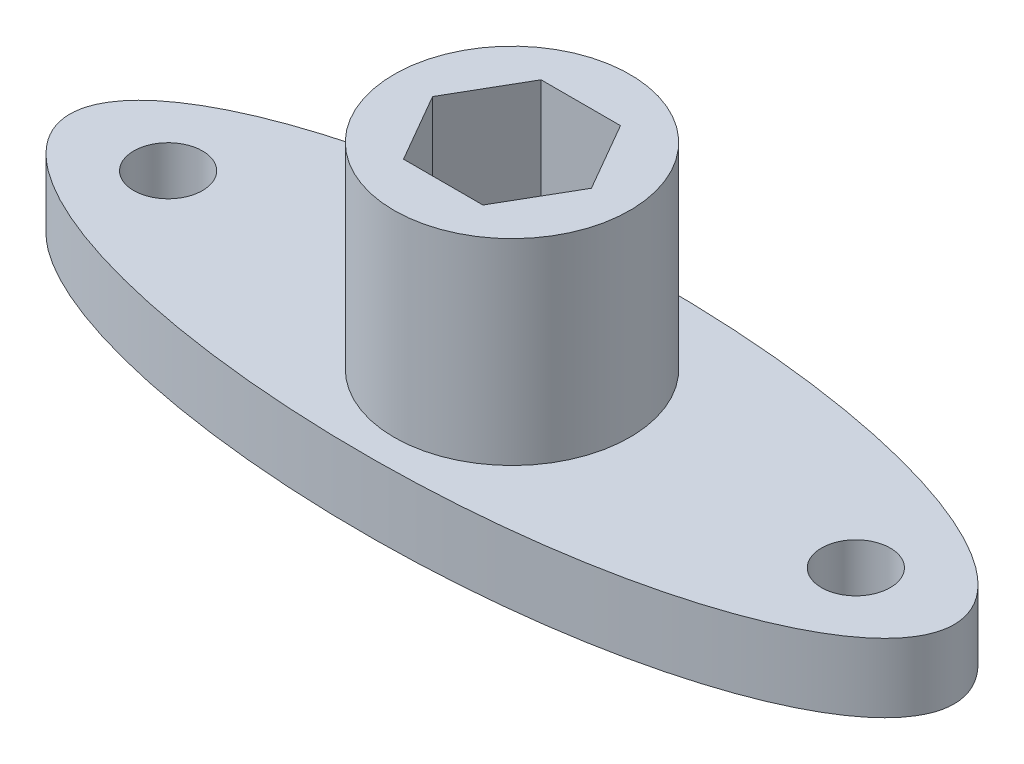
ISO-10303-21;
HEADER;
FILE_DESCRIPTION(('STEP AP214'),'2;1');
FILE_NAME('part.step','',(''),(''),'','','');
FILE_SCHEMA(('AUTOMOTIVE_DESIGN { 1 0 10303 214 1 1 1 1 }'));
ENDSEC;
DATA;
#1=APPLICATION_CONTEXT('core data for automotive mechanical design processes');
#2=APPLICATION_PROTOCOL_DEFINITION('international standard','automotive_design',2000,#1);
#3=PRODUCT_CONTEXT('',#1,'mechanical');
#4=PRODUCT('Part','Part','',(#3));
#5=PRODUCT_RELATED_PRODUCT_CATEGORY('part','',(#4));
#6=PRODUCT_DEFINITION_FORMATION('','',#4);
#7=PRODUCT_DEFINITION_CONTEXT('part definition',#1,'design');
#8=PRODUCT_DEFINITION('design','',#6,#7);
#9=PRODUCT_DEFINITION_SHAPE('','',#8);
#10=(LENGTH_UNIT() NAMED_UNIT(*) SI_UNIT(.MILLI.,.METRE.));
#11=(NAMED_UNIT(*) PLANE_ANGLE_UNIT() SI_UNIT($,.RADIAN.));
#12=(NAMED_UNIT(*) SI_UNIT($,.STERADIAN.) SOLID_ANGLE_UNIT());
#13=UNCERTAINTY_MEASURE_WITH_UNIT(LENGTH_MEASURE(1.E-05),#10,'distance_accuracy_value','');
#14=(GEOMETRIC_REPRESENTATION_CONTEXT(3) GLOBAL_UNCERTAINTY_ASSIGNED_CONTEXT((#13)) GLOBAL_UNIT_ASSIGNED_CONTEXT((#10,
#11,#12)) REPRESENTATION_CONTEXT('',''));
#15=CARTESIAN_POINT('',(0.,0.,0.));
#16=DIRECTION('',(0.,0.,1.));
#17=DIRECTION('',(1.,0.,0.));
#18=AXIS2_PLACEMENT_3D('',#15,#16,#17);
#19=CARTESIAN_POINT('',(0.,3.5,0.));
#20=DIRECTION('',(0.,1.,0.));
#21=DIRECTION('',(0.,0.,1.));
#22=AXIS2_PLACEMENT_3D('',#19,#20,#21);
#23=PLANE('',#22);
#24=CARTESIAN_POINT('',(0.,3.5,0.));
#25=DIRECTION('',(0.,1.,0.));
#26=DIRECTION('',(0.,0.,1.));
#27=AXIS2_PLACEMENT_3D('',#24,#25,#26);
#28=CIRCLE('',#27,6.);
#29=CARTESIAN_POINT('',(0.,3.5,6.));
#30=VERTEX_POINT('',#29);
#31=EDGE_CURVE('E154',#30,#30,#28,.T.);
#32=ORIENTED_EDGE('',*,*,#31,.F.);
#33=EDGE_LOOP('',(#32));
#34=FACE_BOUND('',#33,.T.);
#35=CARTESIAN_POINT('',(17.5,3.5,0.));
#36=DIRECTION('',(0.,1.,0.));
#37=DIRECTION('',(0.,0.,1.));
#38=AXIS2_PLACEMENT_3D('',#35,#36,#37);
#39=CIRCLE('',#38,1.75);
#40=CARTESIAN_POINT('',(17.5,3.5,1.75));
#41=VERTEX_POINT('',#40);
#42=EDGE_CURVE('E180',#41,#41,#39,.T.);
#43=ORIENTED_EDGE('',*,*,#42,.F.);
#44=EDGE_LOOP('',(#43));
#45=FACE_BOUND('',#44,.T.);
#46=CARTESIAN_POINT('',(0.,3.5,0.));
#47=DIRECTION('',(0.,1.,0.));
#48=DIRECTION('',(1.,0.,0.));
#49=AXIS2_PLACEMENT_3D('',#46,#47,#48);
#50=ELLIPSE('',#49,22.5,7.5);
#51=CARTESIAN_POINT('',(22.5,3.5,0.));
#52=VERTEX_POINT('',#51);
#53=EDGE_CURVE('E11',#52,#52,#50,.T.);
#54=ORIENTED_EDGE('',*,*,#53,.T.);
#55=EDGE_LOOP('',(#54));
#56=FACE_BOUND('',#55,.T.);
#57=CARTESIAN_POINT('',(-17.5,3.5,1.11022302462516E-13));
#58=DIRECTION('',(0.,1.,0.));
#59=DIRECTION('',(0.,0.,-1.));
#60=AXIS2_PLACEMENT_3D('',#57,#58,#59);
#61=CIRCLE('',#60,1.75000000000001);
#62=CARTESIAN_POINT('',(-17.5,3.5,-1.7499999999999));
#63=VERTEX_POINT('',#62);
#64=EDGE_CURVE('E172',#63,#63,#61,.T.);
#65=ORIENTED_EDGE('',*,*,#64,.F.);
#66=EDGE_LOOP('',(#65));
#67=FACE_BOUND('',#66,.T.);
#68=ADVANCED_FACE('F39',(#34,#45,#56,#67),#23,.T.);
#69=CARTESIAN_POINT('',(0.,0.,0.));
#70=DIRECTION('',(0.,1.,0.));
#71=DIRECTION('',(0.,0.,1.));
#72=AXIS2_PLACEMENT_3D('',#69,#70,#71);
#73=PLANE('',#72);
#74=CARTESIAN_POINT('',(0.,0.,0.));
#75=DIRECTION('',(0.,1.,0.));
#76=DIRECTION('',(1.,0.,0.));
#77=AXIS2_PLACEMENT_3D('',#74,#75,#76);
#78=ELLIPSE('',#77,22.5,7.5);
#79=CARTESIAN_POINT('',(22.5,0.,0.));
#80=VERTEX_POINT('',#79);
#81=EDGE_CURVE('E44',#80,#80,#78,.T.);
#82=ORIENTED_EDGE('',*,*,#81,.F.);
#83=EDGE_LOOP('',(#82));
#84=FACE_BOUND('',#83,.T.);
#85=CARTESIAN_POINT('',(17.5,0.,0.));
#86=DIRECTION('',(0.,1.,0.));
#87=DIRECTION('',(0.,0.,1.));
#88=AXIS2_PLACEMENT_3D('',#85,#86,#87);
#89=CIRCLE('',#88,1.75);
#90=CARTESIAN_POINT('',(17.5,0.,1.75));
#91=VERTEX_POINT('',#90);
#92=EDGE_CURVE('E176',#91,#91,#89,.T.);
#93=ORIENTED_EDGE('',*,*,#92,.T.);
#94=EDGE_LOOP('',(#93));
#95=FACE_BOUND('',#94,.T.);
#96=CARTESIAN_POINT('',(-17.5,0.,1.11022302462516E-13));
#97=DIRECTION('',(0.,1.,0.));
#98=DIRECTION('',(0.,0.,-1.));
#99=AXIS2_PLACEMENT_3D('',#96,#97,#98);
#100=CIRCLE('',#99,1.75000000000001);
#101=CARTESIAN_POINT('',(-17.5,0.,-1.7499999999999));
#102=VERTEX_POINT('',#101);
#103=EDGE_CURVE('E168',#102,#102,#100,.T.);
#104=ORIENTED_EDGE('',*,*,#103,.T.);
#105=EDGE_LOOP('',(#104));
#106=FACE_BOUND('',#105,.T.);
#107=ADVANCED_FACE('F189',(#84,#95,#106),#73,.F.);
#108=DIRECTION('',(0.,-1.,0.));
#109=VECTOR('',#108,1.);
#110=SURFACE_OF_LINEAR_EXTRUSION('',#50,#109);
#111=ORIENTED_EDGE('',*,*,#53,.F.);
#112=EDGE_LOOP('',(#111));
#113=FACE_BOUND('',#112,.T.);
#114=ORIENTED_EDGE('',*,*,#81,.T.);
#115=EDGE_LOOP('',(#114));
#116=FACE_BOUND('',#115,.T.);
#117=ADVANCED_FACE('F41',(#113,#116),#110,.F.);
#118=CARTESIAN_POINT('',(17.5,3.5,0.));
#119=DIRECTION('',(0.,-1.,0.));
#120=DIRECTION('',(0.,0.,-1.));
#121=AXIS2_PLACEMENT_3D('',#118,#119,#120);
#122=CYLINDRICAL_SURFACE('',#121,1.75);
#123=ORIENTED_EDGE('',*,*,#42,.T.);
#124=EDGE_LOOP('',(#123));
#125=FACE_BOUND('',#124,.T.);
#126=ORIENTED_EDGE('',*,*,#92,.F.);
#127=EDGE_LOOP('',(#126));
#128=FACE_BOUND('',#127,.T.);
#129=ADVANCED_FACE('F192',(#125,#128),#122,.F.);
#130=CARTESIAN_POINT('',(-17.5,3.5,1.11022302462516E-13));
#131=DIRECTION('',(0.,-1.,0.));
#132=DIRECTION('',(0.,0.,-1.));
#133=AXIS2_PLACEMENT_3D('',#130,#131,#132);
#134=CYLINDRICAL_SURFACE('',#133,1.75000000000001);
#135=ORIENTED_EDGE('',*,*,#64,.T.);
#136=EDGE_LOOP('',(#135));
#137=FACE_BOUND('',#136,.T.);
#138=ORIENTED_EDGE('',*,*,#103,.F.);
#139=EDGE_LOOP('',(#138));
#140=FACE_BOUND('',#139,.T.);
#141=ADVANCED_FACE('F194',(#137,#140),#134,.F.);
#142=CARTESIAN_POINT('',(0.,13.5,0.));
#143=DIRECTION('',(0.,-1.,0.));
#144=DIRECTION('',(0.,0.,-1.));
#145=AXIS2_PLACEMENT_3D('',#142,#143,#144);
#146=CYLINDRICAL_SURFACE('',#145,6.);
#147=CARTESIAN_POINT('',(0.,13.5,0.));
#148=DIRECTION('',(0.,1.,0.));
#149=DIRECTION('',(0.,0.,1.));
#150=AXIS2_PLACEMENT_3D('',#147,#148,#149);
#151=CIRCLE('',#150,6.);
#152=CARTESIAN_POINT('',(0.,13.5,6.));
#153=VERTEX_POINT('',#152);
#154=EDGE_CURVE('E164',#153,#153,#151,.T.);
#155=ORIENTED_EDGE('',*,*,#154,.F.);
#156=EDGE_LOOP('',(#155));
#157=FACE_BOUND('',#156,.T.);
#158=ORIENTED_EDGE('',*,*,#31,.T.);
#159=EDGE_LOOP('',(#158));
#160=FACE_BOUND('',#159,.T.);
#161=ADVANCED_FACE('F201',(#157,#160),#146,.T.);
#162=CARTESIAN_POINT('',(0.,13.5,0.));
#163=DIRECTION('',(0.,1.,0.));
#164=DIRECTION('',(0.,0.,1.));
#165=AXIS2_PLACEMENT_3D('',#162,#163,#164);
#166=PLANE('',#165);
#167=DIRECTION('',(1.,0.,0.));
#168=VECTOR('',#167,1.);
#169=CARTESIAN_POINT('',(-2.02072594216369,13.5,3.5));
#170=LINE('',#169,#168);
#171=CARTESIAN_POINT('',(-2.02072594216369,13.5,3.5));
#172=VERTEX_POINT('',#171);
#173=CARTESIAN_POINT('',(2.02072594216369,13.5,3.5));
#174=VERTEX_POINT('',#173);
#175=EDGE_CURVE('E55',#172,#174,#170,.T.);
#176=ORIENTED_EDGE('',*,*,#175,.F.);
#177=DIRECTION('',(0.5,0.,0.866025403784439));
#178=VECTOR('',#177,1.);
#179=CARTESIAN_POINT('',(-4.04145188432738,13.5,0.));
#180=LINE('',#179,#178);
#181=CARTESIAN_POINT('',(-4.04145188432738,13.5,0.));
#182=VERTEX_POINT('',#181);
#183=EDGE_CURVE('E148',#182,#172,#180,.T.);
#184=ORIENTED_EDGE('',*,*,#183,.F.);
#185=DIRECTION('',(-0.5,0.,0.866025403784438));
#186=VECTOR('',#185,1.);
#187=CARTESIAN_POINT('',(-2.02072594216369,13.5,-3.5));
#188=LINE('',#187,#186);
#189=CARTESIAN_POINT('',(-2.02072594216369,13.5,-3.5));
#190=VERTEX_POINT('',#189);
#191=EDGE_CURVE('E145',#190,#182,#188,.T.);
#192=ORIENTED_EDGE('',*,*,#191,.F.);
#193=DIRECTION('',(-1.,0.,0.));
#194=VECTOR('',#193,1.);
#195=CARTESIAN_POINT('',(2.02072594216369,13.5,-3.5));
#196=LINE('',#195,#194);
#197=CARTESIAN_POINT('',(2.02072594216369,13.5,-3.5));
#198=VERTEX_POINT('',#197);
#199=EDGE_CURVE('E103',#198,#190,#196,.T.);
#200=ORIENTED_EDGE('',*,*,#199,.F.);
#201=DIRECTION('',(-0.5,0.,-0.866025403784439));
#202=VECTOR('',#201,1.);
#203=CARTESIAN_POINT('',(4.04145188432738,13.5,0.));
#204=LINE('',#203,#202);
#205=CARTESIAN_POINT('',(4.04145188432738,13.5,0.));
#206=VERTEX_POINT('',#205);
#207=EDGE_CURVE('E139',#206,#198,#204,.T.);
#208=ORIENTED_EDGE('',*,*,#207,.F.);
#209=DIRECTION('',(0.5,0.,-0.866025403784439));
#210=VECTOR('',#209,1.);
#211=CARTESIAN_POINT('',(2.02072594216369,13.5,3.5));
#212=LINE('',#211,#210);
#213=EDGE_CURVE('E135',#174,#206,#212,.T.);
#214=ORIENTED_EDGE('',*,*,#213,.F.);
#215=EDGE_LOOP('',(#176,#184,#192,#200,#208,#214));
#216=FACE_BOUND('',#215,.T.);
#217=ORIENTED_EDGE('',*,*,#154,.T.);
#218=EDGE_LOOP('',(#217));
#219=FACE_BOUND('',#218,.T.);
#220=ADVANCED_FACE('F227',(#216,#219),#166,.T.);
#221=CARTESIAN_POINT('',(-2.02072594216369,7.,3.5));
#222=DIRECTION('',(0.,0.,1.));
#223=DIRECTION('',(1.,0.,0.));
#224=AXIS2_PLACEMENT_3D('',#221,#222,#223);
#225=PLANE('',#224);
#226=ORIENTED_EDGE('',*,*,#175,.T.);
#227=DIRECTION('',(0.,1.,0.));
#228=VECTOR('',#227,1.);
#229=CARTESIAN_POINT('',(2.02072594216369,7.,3.5));
#230=LINE('',#229,#228);
#231=CARTESIAN_POINT('',(2.02072594216369,7.,3.5));
#232=VERTEX_POINT('',#231);
#233=EDGE_CURVE('E85',#232,#174,#230,.T.);
#234=ORIENTED_EDGE('',*,*,#233,.F.);
#235=DIRECTION('',(1.,0.,0.));
#236=VECTOR('',#235,1.);
#237=CARTESIAN_POINT('',(-2.02072594216369,7.,3.5));
#238=LINE('',#237,#236);
#239=CARTESIAN_POINT('',(-2.02072594216369,7.,3.5));
#240=VERTEX_POINT('',#239);
#241=EDGE_CURVE('E151',#240,#232,#238,.T.);
#242=ORIENTED_EDGE('',*,*,#241,.F.);
#243=DIRECTION('',(0.,1.,0.));
#244=VECTOR('',#243,1.);
#245=CARTESIAN_POINT('',(-2.02072594216369,7.,3.5));
#246=LINE('',#245,#244);
#247=EDGE_CURVE('E63',#240,#172,#246,.T.);
#248=ORIENTED_EDGE('',*,*,#247,.T.);
#249=EDGE_LOOP('',(#226,#234,#242,#248));
#250=FACE_BOUND('',#249,.T.);
#251=ADVANCED_FACE('F233',(#250),#225,.F.);
#252=CARTESIAN_POINT('',(-4.04145188432738,7.,0.));
#253=DIRECTION('',(-0.866025403784439,0.,0.5));
#254=DIRECTION('',(0.5,0.,0.866025403784439));
#255=AXIS2_PLACEMENT_3D('',#252,#253,#254);
#256=PLANE('',#255);
#257=ORIENTED_EDGE('',*,*,#183,.T.);
#258=ORIENTED_EDGE('',*,*,#247,.F.);
#259=DIRECTION('',(0.5,0.,0.866025403784439));
#260=VECTOR('',#259,1.);
#261=CARTESIAN_POINT('',(-4.04145188432738,7.,0.));
#262=LINE('',#261,#260);
#263=CARTESIAN_POINT('',(-4.04145188432738,7.,0.));
#264=VERTEX_POINT('',#263);
#265=EDGE_CURVE('E117',#264,#240,#262,.T.);
#266=ORIENTED_EDGE('',*,*,#265,.F.);
#267=DIRECTION('',(0.,1.,0.));
#268=VECTOR('',#267,1.);
#269=CARTESIAN_POINT('',(-4.04145188432738,7.,0.));
#270=LINE('',#269,#268);
#271=EDGE_CURVE('E108',#264,#182,#270,.T.);
#272=ORIENTED_EDGE('',*,*,#271,.T.);
#273=EDGE_LOOP('',(#257,#258,#266,#272));
#274=FACE_BOUND('',#273,.T.);
#275=ADVANCED_FACE('F240',(#274),#256,.F.);
#276=CARTESIAN_POINT('',(-2.02072594216369,7.,-3.5));
#277=DIRECTION('',(-0.866025403784438,0.,-0.5));
#278=DIRECTION('',(-0.5,0.,0.866025403784439));
#279=AXIS2_PLACEMENT_3D('',#276,#277,#278);
#280=PLANE('',#279);
#281=ORIENTED_EDGE('',*,*,#191,.T.);
#282=ORIENTED_EDGE('',*,*,#271,.F.);
#283=DIRECTION('',(-0.5,0.,0.866025403784438));
#284=VECTOR('',#283,1.);
#285=CARTESIAN_POINT('',(-2.02072594216369,7.,-3.5));
#286=LINE('',#285,#284);
#287=CARTESIAN_POINT('',(-2.02072594216369,7.,-3.5));
#288=VERTEX_POINT('',#287);
#289=EDGE_CURVE('E112',#288,#264,#286,.T.);
#290=ORIENTED_EDGE('',*,*,#289,.F.);
#291=DIRECTION('',(0.,1.,0.));
#292=VECTOR('',#291,1.);
#293=CARTESIAN_POINT('',(-2.02072594216369,7.,-3.5));
#294=LINE('',#293,#292);
#295=EDGE_CURVE('E96',#288,#190,#294,.T.);
#296=ORIENTED_EDGE('',*,*,#295,.T.);
#297=EDGE_LOOP('',(#281,#282,#290,#296));
#298=FACE_BOUND('',#297,.T.);
#299=ADVANCED_FACE('F113',(#298),#280,.F.);
#300=CARTESIAN_POINT('',(2.02072594216369,7.,-3.5));
#301=DIRECTION('',(0.,0.,-1.));
#302=DIRECTION('',(-1.,0.,0.));
#303=AXIS2_PLACEMENT_3D('',#300,#301,#302);
#304=PLANE('',#303);
#305=ORIENTED_EDGE('',*,*,#199,.T.);
#306=ORIENTED_EDGE('',*,*,#295,.F.);
#307=DIRECTION('',(-1.,0.,0.));
#308=VECTOR('',#307,1.);
#309=CARTESIAN_POINT('',(2.02072594216369,7.,-3.5));
#310=LINE('',#309,#308);
#311=CARTESIAN_POINT('',(2.02072594216369,7.,-3.5));
#312=VERTEX_POINT('',#311);
#313=EDGE_CURVE('E100',#312,#288,#310,.T.);
#314=ORIENTED_EDGE('',*,*,#313,.F.);
#315=DIRECTION('',(0.,1.,0.));
#316=VECTOR('',#315,1.);
#317=CARTESIAN_POINT('',(2.02072594216369,7.,-3.5));
#318=LINE('',#317,#316);
#319=EDGE_CURVE('E109',#312,#198,#318,.T.);
#320=ORIENTED_EDGE('',*,*,#319,.T.);
#321=EDGE_LOOP('',(#305,#306,#314,#320));
#322=FACE_BOUND('',#321,.T.);
#323=ADVANCED_FACE('F98',(#322),#304,.F.);
#324=CARTESIAN_POINT('',(4.04145188432738,7.,0.));
#325=DIRECTION('',(0.866025403784439,0.,-0.5));
#326=DIRECTION('',(-0.5,0.,-0.866025403784439));
#327=AXIS2_PLACEMENT_3D('',#324,#325,#326);
#328=PLANE('',#327);
#329=ORIENTED_EDGE('',*,*,#207,.T.);
#330=ORIENTED_EDGE('',*,*,#319,.F.);
#331=DIRECTION('',(-0.5,0.,-0.866025403784439));
#332=VECTOR('',#331,1.);
#333=CARTESIAN_POINT('',(4.04145188432738,7.,0.));
#334=LINE('',#333,#332);
#335=CARTESIAN_POINT('',(4.04145188432738,7.,0.));
#336=VERTEX_POINT('',#335);
#337=EDGE_CURVE('E123',#336,#312,#334,.T.);
#338=ORIENTED_EDGE('',*,*,#337,.F.);
#339=DIRECTION('',(0.,1.,0.));
#340=VECTOR('',#339,1.);
#341=CARTESIAN_POINT('',(4.04145188432738,7.,0.));
#342=LINE('',#341,#340);
#343=EDGE_CURVE('E159',#336,#206,#342,.T.);
#344=ORIENTED_EDGE('',*,*,#343,.T.);
#345=EDGE_LOOP('',(#329,#330,#338,#344));
#346=FACE_BOUND('',#345,.T.);
#347=ADVANCED_FACE('F244',(#346),#328,.F.);
#348=CARTESIAN_POINT('',(2.02072594216369,7.,3.5));
#349=DIRECTION('',(0.866025403784438,0.,0.5));
#350=DIRECTION('',(0.5,0.,-0.866025403784439));
#351=AXIS2_PLACEMENT_3D('',#348,#349,#350);
#352=PLANE('',#351);
#353=ORIENTED_EDGE('',*,*,#213,.T.);
#354=ORIENTED_EDGE('',*,*,#343,.F.);
#355=DIRECTION('',(0.5,0.,-0.866025403784439));
#356=VECTOR('',#355,1.);
#357=CARTESIAN_POINT('',(2.02072594216369,7.,3.5));
#358=LINE('',#357,#356);
#359=EDGE_CURVE('E127',#232,#336,#358,.T.);
#360=ORIENTED_EDGE('',*,*,#359,.F.);
#361=ORIENTED_EDGE('',*,*,#233,.T.);
#362=EDGE_LOOP('',(#353,#354,#360,#361));
#363=FACE_BOUND('',#362,.T.);
#364=ADVANCED_FACE('F241',(#363),#352,.F.);
#365=CARTESIAN_POINT('',(0.,7.,0.));
#366=DIRECTION('',(0.,1.,0.));
#367=DIRECTION('',(0.,0.,1.));
#368=AXIS2_PLACEMENT_3D('',#365,#366,#367);
#369=PLANE('',#368);
#370=ORIENTED_EDGE('',*,*,#241,.T.);
#371=ORIENTED_EDGE('',*,*,#359,.T.);
#372=ORIENTED_EDGE('',*,*,#337,.T.);
#373=ORIENTED_EDGE('',*,*,#313,.T.);
#374=ORIENTED_EDGE('',*,*,#289,.T.);
#375=ORIENTED_EDGE('',*,*,#265,.T.);
#376=EDGE_LOOP('',(#370,#371,#372,#373,#374,#375));
#377=FACE_BOUND('',#376,.T.);
#378=ADVANCED_FACE('F120',(#377),#369,.T.);
#379=CLOSED_SHELL('',(#68,#107,#117,#129,#141,#161,#220,#251,#275,#299,#323,#347,#364,#378));
#380=MANIFOLD_SOLID_BREP('B2',#379);
#381=ADVANCED_BREP_SHAPE_REPRESENTATION('',(#18,#380),#14);
#382=SHAPE_DEFINITION_REPRESENTATION(#9,#381);
ENDSEC;
END-ISO-10303-21;
